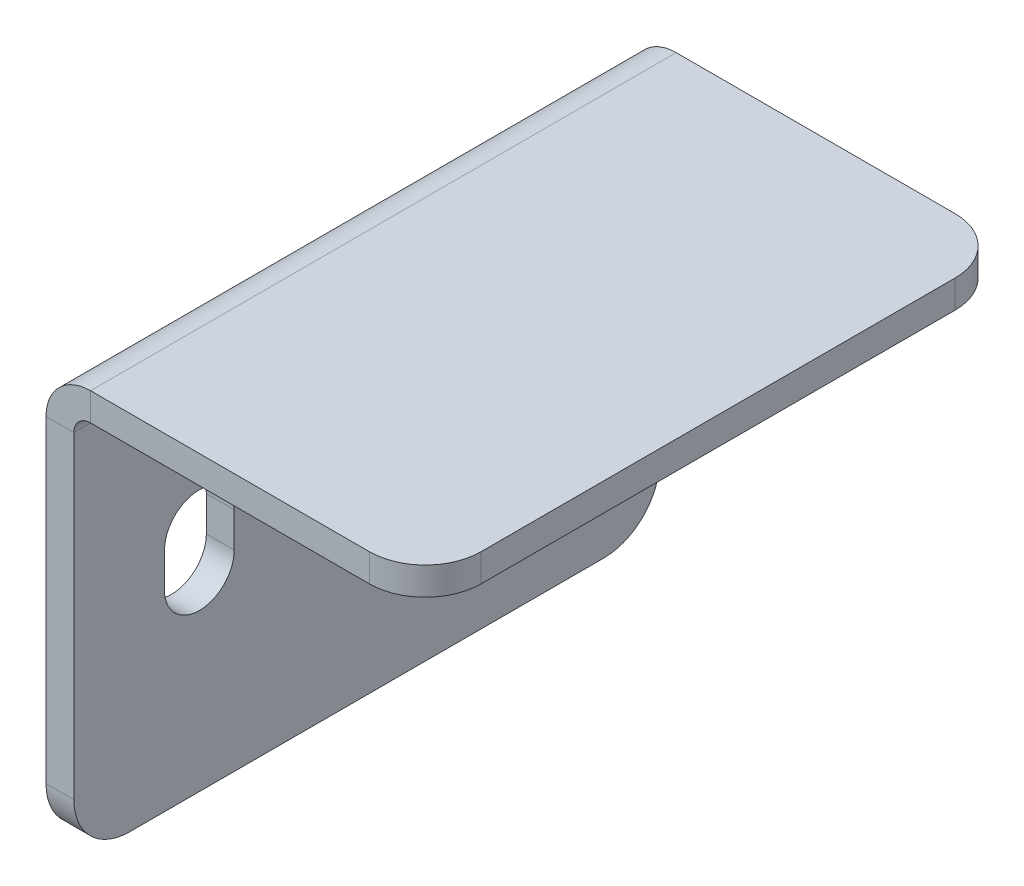
ISO-10303-21;
HEADER;
FILE_DESCRIPTION(('STEP AP214'),'2;1');
FILE_NAME('part.step','',(''),(''),'','','');
FILE_SCHEMA(('AUTOMOTIVE_DESIGN { 1 0 10303 214 1 1 1 1 }'));
ENDSEC;
DATA;
#1=APPLICATION_CONTEXT('core data for automotive mechanical design processes');
#2=APPLICATION_PROTOCOL_DEFINITION('international standard','automotive_design',2000,#1);
#3=PRODUCT_CONTEXT('',#1,'mechanical');
#4=PRODUCT('Part','Part','',(#3));
#5=PRODUCT_RELATED_PRODUCT_CATEGORY('part','',(#4));
#6=PRODUCT_DEFINITION_FORMATION('','',#4);
#7=PRODUCT_DEFINITION_CONTEXT('part definition',#1,'design');
#8=PRODUCT_DEFINITION('design','',#6,#7);
#9=PRODUCT_DEFINITION_SHAPE('','',#8);
#10=(LENGTH_UNIT() NAMED_UNIT(*) SI_UNIT(.MILLI.,.METRE.));
#11=(NAMED_UNIT(*) PLANE_ANGLE_UNIT() SI_UNIT($,.RADIAN.));
#12=(NAMED_UNIT(*) SI_UNIT($,.STERADIAN.) SOLID_ANGLE_UNIT());
#13=UNCERTAINTY_MEASURE_WITH_UNIT(LENGTH_MEASURE(1.E-05),#10,'distance_accuracy_value','');
#14=(GEOMETRIC_REPRESENTATION_CONTEXT(3) GLOBAL_UNCERTAINTY_ASSIGNED_CONTEXT((#13)) GLOBAL_UNIT_ASSIGNED_CONTEXT((#10,
#11,#12)) REPRESENTATION_CONTEXT('',''));
#15=CARTESIAN_POINT('',(0.,0.,0.));
#16=DIRECTION('',(0.,0.,1.));
#17=DIRECTION('',(1.,0.,0.));
#18=AXIS2_PLACEMENT_3D('',#15,#16,#17);
#19=CARTESIAN_POINT('',(12.,2.,-21.));
#20=DIRECTION('',(-1.,0.,0.));
#21=DIRECTION('',(0.,0.,1.));
#22=AXIS2_PLACEMENT_3D('',#19,#20,#21);
#23=PLANE('',#22);
#24=DIRECTION('',(0.,0.,-1.));
#25=VECTOR('',#24,1.);
#26=CARTESIAN_POINT('',(12.,0.,-21.));
#27=LINE('',#26,#25);
#28=CARTESIAN_POINT('',(12.,0.,17.));
#29=VERTEX_POINT('',#28);
#30=CARTESIAN_POINT('',(12.,0.,-17.));
#31=VERTEX_POINT('',#30);
#32=EDGE_CURVE('E354',#29,#31,#27,.T.);
#33=ORIENTED_EDGE('',*,*,#32,.T.);
#34=DIRECTION('',(0.,-1.,0.));
#35=VECTOR('',#34,1.);
#36=CARTESIAN_POINT('',(12.,2.,-17.));
#37=LINE('',#36,#35);
#38=CARTESIAN_POINT('',(12.,2.,-17.));
#39=VERTEX_POINT('',#38);
#40=EDGE_CURVE('E442',#31,#39,#37,.F.);
#41=ORIENTED_EDGE('',*,*,#40,.T.);
#42=DIRECTION('',(0.,0.,-1.));
#43=VECTOR('',#42,1.);
#44=CARTESIAN_POINT('',(12.,2.,-21.));
#45=LINE('',#44,#43);
#46=CARTESIAN_POINT('',(12.,2.,17.));
#47=VERTEX_POINT('',#46);
#48=EDGE_CURVE('E366',#47,#39,#45,.T.);
#49=ORIENTED_EDGE('',*,*,#48,.F.);
#50=DIRECTION('',(0.,-1.,0.));
#51=VECTOR('',#50,1.);
#52=CARTESIAN_POINT('',(12.,2.,17.));
#53=LINE('',#52,#51);
#54=EDGE_CURVE('E438',#47,#29,#53,.T.);
#55=ORIENTED_EDGE('',*,*,#54,.T.);
#56=EDGE_LOOP('',(#33,#41,#49,#55));
#57=FACE_BOUND('',#56,.T.);
#58=ADVANCED_FACE('F79',(#57),#23,.F.);
#59=CARTESIAN_POINT('',(-12.,2.,-21.));
#60=DIRECTION('',(0.,0.,1.));
#61=DIRECTION('',(1.,0.,0.));
#62=AXIS2_PLACEMENT_3D('',#59,#60,#61);
#63=PLANE('',#62);
#64=DIRECTION('',(-1.,0.,0.));
#65=VECTOR('',#64,1.);
#66=CARTESIAN_POINT('',(-12.,2.,-21.));
#67=LINE('',#66,#65);
#68=CARTESIAN_POINT('',(8.,2.,-21.));
#69=VERTEX_POINT('',#68);
#70=CARTESIAN_POINT('',(-12.,1.99999999999999,-21.));
#71=VERTEX_POINT('',#70);
#72=EDGE_CURVE('E370',#69,#71,#67,.T.);
#73=ORIENTED_EDGE('',*,*,#72,.F.);
#74=DIRECTION('',(0.,-1.,0.));
#75=VECTOR('',#74,1.);
#76=CARTESIAN_POINT('',(8.,2.,-21.));
#77=LINE('',#76,#75);
#78=CARTESIAN_POINT('',(8.,0.,-21.));
#79=VERTEX_POINT('',#78);
#80=EDGE_CURVE('E428',#69,#79,#77,.T.);
#81=ORIENTED_EDGE('',*,*,#80,.T.);
#82=DIRECTION('',(-1.,0.,0.));
#83=VECTOR('',#82,1.);
#84=CARTESIAN_POINT('',(-12.,0.,-21.));
#85=LINE('',#84,#83);
#86=CARTESIAN_POINT('',(-12.,0.,-21.));
#87=VERTEX_POINT('',#86);
#88=EDGE_CURVE('E386',#79,#87,#85,.T.);
#89=ORIENTED_EDGE('',*,*,#88,.T.);
#90=DIRECTION('',(0.,-1.,0.));
#91=VECTOR('',#90,1.);
#92=CARTESIAN_POINT('',(-12.,2.,-21.));
#93=LINE('',#92,#91);
#94=EDGE_CURVE('E398',#71,#87,#93,.T.);
#95=ORIENTED_EDGE('',*,*,#94,.F.);
#96=EDGE_LOOP('',(#73,#81,#89,#95));
#97=FACE_BOUND('',#96,.T.);
#98=ADVANCED_FACE('F460',(#97),#63,.F.);
#99=CARTESIAN_POINT('',(-12.,2.,21.));
#100=DIRECTION('',(0.,0.,-1.));
#101=DIRECTION('',(-1.,0.,0.));
#102=AXIS2_PLACEMENT_3D('',#99,#100,#101);
#103=PLANE('',#102);
#104=DIRECTION('',(1.,0.,0.));
#105=VECTOR('',#104,1.);
#106=CARTESIAN_POINT('',(-12.,0.,21.));
#107=LINE('',#106,#105);
#108=CARTESIAN_POINT('',(-12.,0.,21.));
#109=VERTEX_POINT('',#108);
#110=CARTESIAN_POINT('',(8.00000000000001,0.,21.));
#111=VERTEX_POINT('',#110);
#112=EDGE_CURVE('E371',#109,#111,#107,.T.);
#113=ORIENTED_EDGE('',*,*,#112,.T.);
#114=DIRECTION('',(0.,-1.,0.));
#115=VECTOR('',#114,1.);
#116=CARTESIAN_POINT('',(8.00000000000001,2.,21.));
#117=LINE('',#116,#115);
#118=CARTESIAN_POINT('',(8.00000000000001,2.,21.));
#119=VERTEX_POINT('',#118);
#120=EDGE_CURVE('E15',#111,#119,#117,.F.);
#121=ORIENTED_EDGE('',*,*,#120,.T.);
#122=DIRECTION('',(1.,0.,0.));
#123=VECTOR('',#122,1.);
#124=CARTESIAN_POINT('',(-12.,2.,21.));
#125=LINE('',#124,#123);
#126=CARTESIAN_POINT('',(-12.,2.,21.));
#127=VERTEX_POINT('',#126);
#128=EDGE_CURVE('E378',#127,#119,#125,.T.);
#129=ORIENTED_EDGE('',*,*,#128,.F.);
#130=DIRECTION('',(0.,-1.,0.));
#131=VECTOR('',#130,1.);
#132=CARTESIAN_POINT('',(-12.,2.,21.));
#133=LINE('',#132,#131);
#134=EDGE_CURVE('E382',#127,#109,#133,.T.);
#135=ORIENTED_EDGE('',*,*,#134,.T.);
#136=EDGE_LOOP('',(#113,#121,#129,#135));
#137=FACE_BOUND('',#136,.T.);
#138=ADVANCED_FACE('F474',(#137),#103,.F.);
#139=CARTESIAN_POINT('',(0.,2.,0.));
#140=DIRECTION('',(0.,1.,0.));
#141=DIRECTION('',(0.,0.,1.));
#142=AXIS2_PLACEMENT_3D('',#139,#140,#141);
#143=PLANE('',#142);
#144=ORIENTED_EDGE('',*,*,#48,.T.);
#145=CARTESIAN_POINT('',(8.,2.,-17.));
#146=DIRECTION('',(0.,1.,0.));
#147=DIRECTION('',(0.,0.,1.));
#148=AXIS2_PLACEMENT_3D('',#145,#146,#147);
#149=CIRCLE('',#148,4.);
#150=EDGE_CURVE('E88',#39,#69,#149,.T.);
#151=ORIENTED_EDGE('',*,*,#150,.T.);
#152=ORIENTED_EDGE('',*,*,#72,.T.);
#153=DIRECTION('',(0.,0.,1.));
#154=VECTOR('',#153,1.);
#155=CARTESIAN_POINT('',(-12.,2.,-21.));
#156=LINE('',#155,#154);
#157=EDGE_CURVE('E374',#71,#127,#156,.T.);
#158=ORIENTED_EDGE('',*,*,#157,.T.);
#159=ORIENTED_EDGE('',*,*,#128,.T.);
#160=CARTESIAN_POINT('',(8.00000000000001,2.,17.));
#161=DIRECTION('',(0.,1.,0.));
#162=DIRECTION('',(0.,0.,1.));
#163=AXIS2_PLACEMENT_3D('',#160,#161,#162);
#164=CIRCLE('',#163,4.);
#165=EDGE_CURVE('E445',#119,#47,#164,.T.);
#166=ORIENTED_EDGE('',*,*,#165,.T.);
#167=EDGE_LOOP('',(#144,#151,#152,#158,#159,#166));
#168=FACE_BOUND('',#167,.T.);
#169=ADVANCED_FACE('F452',(#168),#143,.T.);
#170=CARTESIAN_POINT('',(0.,0.,0.));
#171=DIRECTION('',(0.,1.,0.));
#172=DIRECTION('',(0.,0.,1.));
#173=AXIS2_PLACEMENT_3D('',#170,#171,#172);
#174=PLANE('',#173);
#175=ORIENTED_EDGE('',*,*,#88,.F.);
#176=CARTESIAN_POINT('',(8.,0.,-17.));
#177=DIRECTION('',(0.,1.,0.));
#178=DIRECTION('',(0.,0.,1.));
#179=AXIS2_PLACEMENT_3D('',#176,#177,#178);
#180=CIRCLE('',#179,4.);
#181=EDGE_CURVE('E435',#79,#31,#180,.F.);
#182=ORIENTED_EDGE('',*,*,#181,.T.);
#183=ORIENTED_EDGE('',*,*,#32,.F.);
#184=CARTESIAN_POINT('',(8.00000000000001,0.,17.));
#185=DIRECTION('',(0.,1.,0.));
#186=DIRECTION('',(0.,0.,1.));
#187=AXIS2_PLACEMENT_3D('',#184,#185,#186);
#188=CIRCLE('',#187,4.);
#189=EDGE_CURVE('E432',#29,#111,#188,.F.);
#190=ORIENTED_EDGE('',*,*,#189,.T.);
#191=ORIENTED_EDGE('',*,*,#112,.F.);
#192=DIRECTION('',(0.,0.,1.));
#193=VECTOR('',#192,1.);
#194=CARTESIAN_POINT('',(-12.,0.,-21.));
#195=LINE('',#194,#193);
#196=EDGE_CURVE('E389',#87,#109,#195,.T.);
#197=ORIENTED_EDGE('',*,*,#196,.F.);
#198=EDGE_LOOP('',(#175,#182,#183,#190,#191,#197));
#199=FACE_BOUND('',#198,.T.);
#200=ADVANCED_FACE('F465',(#199),#174,.F.);
#201=CARTESIAN_POINT('',(-12.,-1.2,21.));
#202=DIRECTION('',(0.,0.,1.));
#203=DIRECTION('',(0.,-1.,0.));
#204=AXIS2_PLACEMENT_3D('',#201,#202,#203);
#205=PLANE('',#204);
#206=DIRECTION('',(-1.,0.,0.));
#207=VECTOR('',#206,1.);
#208=CARTESIAN_POINT('',(-15.2,-1.19999999999999,21.));
#209=LINE('',#208,#207);
#210=CARTESIAN_POINT('',(-13.2,-1.2,21.));
#211=VERTEX_POINT('',#210);
#212=CARTESIAN_POINT('',(-15.2,-1.19999999999999,21.));
#213=VERTEX_POINT('',#212);
#214=EDGE_CURVE('E266',#211,#213,#209,.T.);
#215=ORIENTED_EDGE('',*,*,#214,.F.);
#216=CARTESIAN_POINT('',(-12.,-1.2,21.));
#217=DIRECTION('',(0.,0.,-1.));
#218=DIRECTION('',(0.,1.,0.));
#219=AXIS2_PLACEMENT_3D('',#216,#217,#218);
#220=CIRCLE('',#219,1.2);
#221=EDGE_CURVE('E359',#109,#211,#220,.F.);
#222=ORIENTED_EDGE('',*,*,#221,.F.);
#223=ORIENTED_EDGE('',*,*,#134,.F.);
#224=CARTESIAN_POINT('',(-12.,-1.2,21.));
#225=DIRECTION('',(0.,0.,-1.));
#226=DIRECTION('',(0.,1.,0.));
#227=AXIS2_PLACEMENT_3D('',#224,#225,#226);
#228=CIRCLE('',#227,3.2);
#229=EDGE_CURVE('E350',#127,#213,#228,.F.);
#230=ORIENTED_EDGE('',*,*,#229,.T.);
#231=EDGE_LOOP('',(#215,#222,#223,#230));
#232=FACE_BOUND('',#231,.T.);
#233=ADVANCED_FACE('F479',(#232),#205,.T.);
#234=CARTESIAN_POINT('',(-12.,-1.2,-21.));
#235=DIRECTION('',(0.,0.,1.));
#236=DIRECTION('',(0.,-1.,0.));
#237=AXIS2_PLACEMENT_3D('',#234,#235,#236);
#238=PLANE('',#237);
#239=CARTESIAN_POINT('',(-12.,-1.2,-21.));
#240=DIRECTION('',(0.,0.,-1.));
#241=DIRECTION('',(0.,1.,0.));
#242=AXIS2_PLACEMENT_3D('',#239,#240,#241);
#243=CIRCLE('',#242,1.2);
#244=CARTESIAN_POINT('',(-13.2,-1.2,-21.));
#245=VERTEX_POINT('',#244);
#246=EDGE_CURVE('E316',#245,#87,#243,.T.);
#247=ORIENTED_EDGE('',*,*,#246,.F.);
#248=DIRECTION('',(-1.,0.,0.));
#249=VECTOR('',#248,1.);
#250=CARTESIAN_POINT('',(-13.2,-1.2,-21.));
#251=LINE('',#250,#249);
#252=CARTESIAN_POINT('',(-15.2,-1.19999999999999,-21.));
#253=VERTEX_POINT('',#252);
#254=EDGE_CURVE('E340',#245,#253,#251,.T.);
#255=ORIENTED_EDGE('',*,*,#254,.T.);
#256=CARTESIAN_POINT('',(-12.,-1.2,-21.));
#257=DIRECTION('',(0.,0.,-1.));
#258=DIRECTION('',(0.,1.,0.));
#259=AXIS2_PLACEMENT_3D('',#256,#257,#258);
#260=CIRCLE('',#259,3.2);
#261=EDGE_CURVE('E355',#253,#71,#260,.T.);
#262=ORIENTED_EDGE('',*,*,#261,.T.);
#263=ORIENTED_EDGE('',*,*,#94,.T.);
#264=EDGE_LOOP('',(#247,#255,#262,#263));
#265=FACE_BOUND('',#264,.T.);
#266=ADVANCED_FACE('F485',(#265),#238,.F.);
#267=CARTESIAN_POINT('',(-12.,-1.2,-21.));
#268=DIRECTION('',(0.,0.,-1.));
#269=DIRECTION('',(-1.,0.,0.));
#270=AXIS2_PLACEMENT_3D('',#267,#268,#269);
#271=CYLINDRICAL_SURFACE('',#270,3.2);
#272=ORIENTED_EDGE('',*,*,#157,.F.);
#273=ORIENTED_EDGE('',*,*,#261,.F.);
#274=DIRECTION('',(0.,0.,-1.));
#275=VECTOR('',#274,1.);
#276=CARTESIAN_POINT('',(-15.2,-1.19999999999999,0.));
#277=LINE('',#276,#275);
#278=EDGE_CURVE('E336',#213,#253,#277,.T.);
#279=ORIENTED_EDGE('',*,*,#278,.F.);
#280=ORIENTED_EDGE('',*,*,#229,.F.);
#281=EDGE_LOOP('',(#272,#273,#279,#280));
#282=FACE_BOUND('',#281,.T.);
#283=ADVANCED_FACE('F482',(#282),#271,.T.);
#284=CARTESIAN_POINT('',(-12.,-1.2,-21.));
#285=DIRECTION('',(0.,0.,-1.));
#286=DIRECTION('',(-1.,0.,0.));
#287=AXIS2_PLACEMENT_3D('',#284,#285,#286);
#288=CYLINDRICAL_SURFACE('',#287,1.2);
#289=ORIENTED_EDGE('',*,*,#196,.T.);
#290=ORIENTED_EDGE('',*,*,#221,.T.);
#291=DIRECTION('',(0.,0.,1.));
#292=VECTOR('',#291,1.);
#293=CARTESIAN_POINT('',(-13.2,-1.2,21.));
#294=LINE('',#293,#292);
#295=EDGE_CURVE('E344',#211,#245,#294,.F.);
#296=ORIENTED_EDGE('',*,*,#295,.T.);
#297=ORIENTED_EDGE('',*,*,#246,.T.);
#298=EDGE_LOOP('',(#289,#290,#296,#297));
#299=FACE_BOUND('',#298,.T.);
#300=ADVANCED_FACE('F514',(#299),#288,.F.);
#301=CARTESIAN_POINT('',(-15.2,0.,-21.));
#302=DIRECTION('',(0.,0.,-1.));
#303=DIRECTION('',(0.,1.,0.));
#304=AXIS2_PLACEMENT_3D('',#301,#302,#303);
#305=PLANE('',#304);
#306=DIRECTION('',(0.,-1.,0.));
#307=VECTOR('',#306,1.);
#308=CARTESIAN_POINT('',(-13.2,0.,-21.));
#309=LINE('',#308,#307);
#310=CARTESIAN_POINT('',(-13.2000000000001,-24.,-21.));
#311=VERTEX_POINT('',#310);
#312=EDGE_CURVE('E325',#311,#245,#309,.F.);
#313=ORIENTED_EDGE('',*,*,#312,.F.);
#314=DIRECTION('',(1.,0.,0.));
#315=VECTOR('',#314,1.);
#316=CARTESIAN_POINT('',(-15.2000000000001,-24.,-21.));
#317=LINE('',#316,#315);
#318=CARTESIAN_POINT('',(-15.2000000000001,-24.,-21.));
#319=VERTEX_POINT('',#318);
#320=EDGE_CURVE('E415',#311,#319,#317,.F.);
#321=ORIENTED_EDGE('',*,*,#320,.T.);
#322=DIRECTION('',(0.,1.,0.));
#323=VECTOR('',#322,1.);
#324=CARTESIAN_POINT('',(-15.2,0.,-21.));
#325=LINE('',#324,#323);
#326=EDGE_CURVE('E313',#319,#253,#325,.T.);
#327=ORIENTED_EDGE('',*,*,#326,.T.);
#328=ORIENTED_EDGE('',*,*,#254,.F.);
#329=EDGE_LOOP('',(#313,#321,#327,#328));
#330=FACE_BOUND('',#329,.T.);
#331=ADVANCED_FACE('F512',(#330),#305,.T.);
#332=CARTESIAN_POINT('',(-15.2000000000001,-28.,21.));
#333=DIRECTION('',(0.,0.,1.));
#334=DIRECTION('',(0.,-1.,0.));
#335=AXIS2_PLACEMENT_3D('',#332,#333,#334);
#336=PLANE('',#335);
#337=DIRECTION('',(0.,-1.,0.));
#338=VECTOR('',#337,1.);
#339=CARTESIAN_POINT('',(-15.2000000000001,-28.,21.));
#340=LINE('',#339,#338);
#341=CARTESIAN_POINT('',(-15.2000000000001,-24.,21.));
#342=VERTEX_POINT('',#341);
#343=EDGE_CURVE('E321',#213,#342,#340,.T.);
#344=ORIENTED_EDGE('',*,*,#343,.T.);
#345=DIRECTION('',(1.,0.,0.));
#346=VECTOR('',#345,1.);
#347=CARTESIAN_POINT('',(-15.2000000000001,-24.,21.));
#348=LINE('',#347,#346);
#349=CARTESIAN_POINT('',(-13.2000000000001,-24.,21.));
#350=VERTEX_POINT('',#349);
#351=EDGE_CURVE('E424',#342,#350,#348,.T.);
#352=ORIENTED_EDGE('',*,*,#351,.T.);
#353=DIRECTION('',(0.,1.,0.));
#354=VECTOR('',#353,1.);
#355=CARTESIAN_POINT('',(-13.2,0.,21.));
#356=LINE('',#355,#354);
#357=EDGE_CURVE('E332',#211,#350,#356,.F.);
#358=ORIENTED_EDGE('',*,*,#357,.F.);
#359=ORIENTED_EDGE('',*,*,#214,.T.);
#360=EDGE_LOOP('',(#344,#352,#358,#359));
#361=FACE_BOUND('',#360,.T.);
#362=ADVANCED_FACE('F497',(#361),#336,.T.);
#363=CARTESIAN_POINT('',(-15.2,0.,0.));
#364=DIRECTION('',(-1.,0.,0.));
#365=DIRECTION('',(0.,-1.,0.));
#366=AXIS2_PLACEMENT_3D('',#363,#364,#365);
#367=PLANE('',#366);
#368=CARTESIAN_POINT('',(-15.2,-14.25,-12.));
#369=DIRECTION('',(1.,0.,0.));
#370=DIRECTION('',(0.,-1.,0.));
#371=AXIS2_PLACEMENT_3D('',#368,#369,#370);
#372=CIRCLE('',#371,2.5);
#373=CARTESIAN_POINT('',(-15.2,-14.25,-9.49999999999999));
#374=VERTEX_POINT('',#373);
#375=CARTESIAN_POINT('',(-15.2,-14.25,-14.5));
#376=VERTEX_POINT('',#375);
#377=EDGE_CURVE('E220',#374,#376,#372,.T.);
#378=ORIENTED_EDGE('',*,*,#377,.T.);
#379=DIRECTION('',(0.,1.,0.));
#380=VECTOR('',#379,1.);
#381=CARTESIAN_POINT('',(-15.2,-14.25,-14.5));
#382=LINE('',#381,#380);
#383=CARTESIAN_POINT('',(-15.2,-11.75,-14.5));
#384=VERTEX_POINT('',#383);
#385=EDGE_CURVE('E232',#376,#384,#382,.T.);
#386=ORIENTED_EDGE('',*,*,#385,.T.);
#387=CARTESIAN_POINT('',(-15.2,-11.75,-12.));
#388=DIRECTION('',(1.,0.,0.));
#389=DIRECTION('',(0.,-1.,0.));
#390=AXIS2_PLACEMENT_3D('',#387,#388,#389);
#391=CIRCLE('',#390,2.5);
#392=CARTESIAN_POINT('',(-15.2,-11.75,-9.49999999999999));
#393=VERTEX_POINT('',#392);
#394=EDGE_CURVE('E95',#384,#393,#391,.T.);
#395=ORIENTED_EDGE('',*,*,#394,.T.);
#396=DIRECTION('',(0.,-1.,0.));
#397=VECTOR('',#396,1.);
#398=CARTESIAN_POINT('',(-15.2,-14.25,-9.49999999999999));
#399=LINE('',#398,#397);
#400=EDGE_CURVE('E229',#393,#374,#399,.T.);
#401=ORIENTED_EDGE('',*,*,#400,.T.);
#402=EDGE_LOOP('',(#378,#386,#395,#401));
#403=FACE_BOUND('',#402,.T.);
#404=CARTESIAN_POINT('',(-15.2,-14.25,12.));
#405=DIRECTION('',(1.,0.,0.));
#406=DIRECTION('',(0.,1.,0.));
#407=AXIS2_PLACEMENT_3D('',#404,#405,#406);
#408=CIRCLE('',#407,2.5);
#409=CARTESIAN_POINT('',(-15.2,-14.25,14.5));
#410=VERTEX_POINT('',#409);
#411=CARTESIAN_POINT('',(-15.2,-14.25,9.49999999999999));
#412=VERTEX_POINT('',#411);
#413=EDGE_CURVE('E272',#410,#412,#408,.T.);
#414=ORIENTED_EDGE('',*,*,#413,.T.);
#415=DIRECTION('',(0.,1.,0.));
#416=VECTOR('',#415,1.);
#417=CARTESIAN_POINT('',(-15.2,-14.25,9.49999999999999));
#418=LINE('',#417,#416);
#419=CARTESIAN_POINT('',(-15.2,-11.75,9.49999999999999));
#420=VERTEX_POINT('',#419);
#421=EDGE_CURVE('E276',#412,#420,#418,.T.);
#422=ORIENTED_EDGE('',*,*,#421,.T.);
#423=CARTESIAN_POINT('',(-15.2,-11.75,12.));
#424=DIRECTION('',(1.,0.,0.));
#425=DIRECTION('',(0.,1.,0.));
#426=AXIS2_PLACEMENT_3D('',#423,#424,#425);
#427=CIRCLE('',#426,2.5);
#428=CARTESIAN_POINT('',(-15.2,-11.75,14.5));
#429=VERTEX_POINT('',#428);
#430=EDGE_CURVE('E103',#420,#429,#427,.T.);
#431=ORIENTED_EDGE('',*,*,#430,.T.);
#432=DIRECTION('',(0.,-1.,0.));
#433=VECTOR('',#432,1.);
#434=CARTESIAN_POINT('',(-15.2,-14.25,14.5));
#435=LINE('',#434,#433);
#436=EDGE_CURVE('E283',#429,#410,#435,.T.);
#437=ORIENTED_EDGE('',*,*,#436,.T.);
#438=EDGE_LOOP('',(#414,#422,#431,#437));
#439=FACE_BOUND('',#438,.T.);
#440=ORIENTED_EDGE('',*,*,#326,.F.);
#441=CARTESIAN_POINT('',(-15.2000000000001,-24.,-17.));
#442=DIRECTION('',(-1.,0.,0.));
#443=DIRECTION('',(0.,-1.,0.));
#444=AXIS2_PLACEMENT_3D('',#441,#442,#443);
#445=CIRCLE('',#444,4.);
#446=CARTESIAN_POINT('',(-15.2000000000001,-28.,-17.));
#447=VERTEX_POINT('',#446);
#448=EDGE_CURVE('E421',#319,#447,#445,.T.);
#449=ORIENTED_EDGE('',*,*,#448,.T.);
#450=DIRECTION('',(0.,0.,-1.));
#451=VECTOR('',#450,1.);
#452=CARTESIAN_POINT('',(-15.2000000000001,-28.,-21.));
#453=LINE('',#452,#451);
#454=CARTESIAN_POINT('',(-15.2000000000001,-28.,17.));
#455=VERTEX_POINT('',#454);
#456=EDGE_CURVE('E317',#455,#447,#453,.T.);
#457=ORIENTED_EDGE('',*,*,#456,.F.);
#458=CARTESIAN_POINT('',(-15.2000000000001,-24.,17.));
#459=DIRECTION('',(-1.,0.,0.));
#460=DIRECTION('',(0.,-1.,0.));
#461=AXIS2_PLACEMENT_3D('',#458,#459,#460);
#462=CIRCLE('',#461,4.);
#463=EDGE_CURVE('E418',#455,#342,#462,.T.);
#464=ORIENTED_EDGE('',*,*,#463,.T.);
#465=ORIENTED_EDGE('',*,*,#343,.F.);
#466=ORIENTED_EDGE('',*,*,#278,.T.);
#467=EDGE_LOOP('',(#440,#449,#457,#464,#465,#466));
#468=FACE_BOUND('',#467,.T.);
#469=ADVANCED_FACE('F237',(#403,#439,#468),#367,.T.);
#470=CARTESIAN_POINT('',(-13.2,0.,0.));
#471=DIRECTION('',(-1.,0.,0.));
#472=DIRECTION('',(0.,-1.,0.));
#473=AXIS2_PLACEMENT_3D('',#470,#471,#472);
#474=PLANE('',#473);
#475=DIRECTION('',(0.,1.,0.));
#476=VECTOR('',#475,1.);
#477=CARTESIAN_POINT('',(-13.2,-14.25,-14.5));
#478=LINE('',#477,#476);
#479=CARTESIAN_POINT('',(-13.2,-14.25,-14.5));
#480=VERTEX_POINT('',#479);
#481=CARTESIAN_POINT('',(-13.2,-11.75,-14.5));
#482=VERTEX_POINT('',#481);
#483=EDGE_CURVE('E256',#480,#482,#478,.T.);
#484=ORIENTED_EDGE('',*,*,#483,.F.);
#485=CARTESIAN_POINT('',(-13.2,-14.25,-12.));
#486=DIRECTION('',(1.,0.,0.));
#487=DIRECTION('',(0.,-1.,0.));
#488=AXIS2_PLACEMENT_3D('',#485,#486,#487);
#489=CIRCLE('',#488,2.5);
#490=CARTESIAN_POINT('',(-13.2,-14.25,-9.49999999999999));
#491=VERTEX_POINT('',#490);
#492=EDGE_CURVE('E223',#491,#480,#489,.T.);
#493=ORIENTED_EDGE('',*,*,#492,.F.);
#494=DIRECTION('',(0.,-1.,0.));
#495=VECTOR('',#494,1.);
#496=CARTESIAN_POINT('',(-13.2,-14.25,-9.49999999999999));
#497=LINE('',#496,#495);
#498=CARTESIAN_POINT('',(-13.2,-11.75,-9.49999999999999));
#499=VERTEX_POINT('',#498);
#500=EDGE_CURVE('E241',#499,#491,#497,.T.);
#501=ORIENTED_EDGE('',*,*,#500,.F.);
#502=CARTESIAN_POINT('',(-13.2,-11.75,-12.));
#503=DIRECTION('',(1.,0.,0.));
#504=DIRECTION('',(0.,-1.,0.));
#505=AXIS2_PLACEMENT_3D('',#502,#503,#504);
#506=CIRCLE('',#505,2.5);
#507=EDGE_CURVE('E247',#482,#499,#506,.T.);
#508=ORIENTED_EDGE('',*,*,#507,.F.);
#509=EDGE_LOOP('',(#484,#493,#501,#508));
#510=FACE_BOUND('',#509,.T.);
#511=DIRECTION('',(0.,1.,0.));
#512=VECTOR('',#511,1.);
#513=CARTESIAN_POINT('',(-13.2,-14.25,9.49999999999999));
#514=LINE('',#513,#512);
#515=CARTESIAN_POINT('',(-13.2,-14.25,9.49999999999999));
#516=VERTEX_POINT('',#515);
#517=CARTESIAN_POINT('',(-13.2,-11.75,9.49999999999999));
#518=VERTEX_POINT('',#517);
#519=EDGE_CURVE('E291',#516,#518,#514,.T.);
#520=ORIENTED_EDGE('',*,*,#519,.F.);
#521=CARTESIAN_POINT('',(-13.2,-14.25,12.));
#522=DIRECTION('',(1.,0.,0.));
#523=DIRECTION('',(0.,1.,0.));
#524=AXIS2_PLACEMENT_3D('',#521,#522,#523);
#525=CIRCLE('',#524,2.5);
#526=CARTESIAN_POINT('',(-13.2,-14.25,14.5));
#527=VERTEX_POINT('',#526);
#528=EDGE_CURVE('E288',#527,#516,#525,.T.);
#529=ORIENTED_EDGE('',*,*,#528,.F.);
#530=DIRECTION('',(0.,-1.,0.));
#531=VECTOR('',#530,1.);
#532=CARTESIAN_POINT('',(-13.2,-14.25,14.5));
#533=LINE('',#532,#531);
#534=CARTESIAN_POINT('',(-13.2,-11.75,14.5));
#535=VERTEX_POINT('',#534);
#536=EDGE_CURVE('E277',#535,#527,#533,.T.);
#537=ORIENTED_EDGE('',*,*,#536,.F.);
#538=CARTESIAN_POINT('',(-13.2,-11.75,12.));
#539=DIRECTION('',(1.,0.,0.));
#540=DIRECTION('',(0.,1.,0.));
#541=AXIS2_PLACEMENT_3D('',#538,#539,#540);
#542=CIRCLE('',#541,2.5);
#543=EDGE_CURVE('E295',#518,#535,#542,.T.);
#544=ORIENTED_EDGE('',*,*,#543,.F.);
#545=EDGE_LOOP('',(#520,#529,#537,#544));
#546=FACE_BOUND('',#545,.T.);
#547=DIRECTION('',(0.,0.,1.));
#548=VECTOR('',#547,1.);
#549=CARTESIAN_POINT('',(-13.2000000000001,-28.,0.));
#550=LINE('',#549,#548);
#551=CARTESIAN_POINT('',(-13.2000000000001,-28.,17.));
#552=VERTEX_POINT('',#551);
#553=CARTESIAN_POINT('',(-13.2000000000001,-28.,-17.));
#554=VERTEX_POINT('',#553);
#555=EDGE_CURVE('E328',#552,#554,#550,.F.);
#556=ORIENTED_EDGE('',*,*,#555,.T.);
#557=CARTESIAN_POINT('',(-13.2000000000001,-24.,-17.));
#558=DIRECTION('',(-1.,0.,0.));
#559=DIRECTION('',(0.,-1.,0.));
#560=AXIS2_PLACEMENT_3D('',#557,#558,#559);
#561=CIRCLE('',#560,4.);
#562=EDGE_CURVE('E412',#554,#311,#561,.F.);
#563=ORIENTED_EDGE('',*,*,#562,.T.);
#564=ORIENTED_EDGE('',*,*,#312,.T.);
#565=ORIENTED_EDGE('',*,*,#295,.F.);
#566=ORIENTED_EDGE('',*,*,#357,.T.);
#567=CARTESIAN_POINT('',(-13.2000000000001,-24.,17.));
#568=DIRECTION('',(-1.,0.,0.));
#569=DIRECTION('',(0.,-1.,0.));
#570=AXIS2_PLACEMENT_3D('',#567,#568,#569);
#571=CIRCLE('',#570,4.);
#572=EDGE_CURVE('E409',#350,#552,#571,.F.);
#573=ORIENTED_EDGE('',*,*,#572,.T.);
#574=EDGE_LOOP('',(#556,#563,#564,#565,#566,#573));
#575=FACE_BOUND('',#574,.T.);
#576=ADVANCED_FACE('F504',(#510,#546,#575),#474,.F.);
#577=CARTESIAN_POINT('',(-15.2000000000001,-28.,-21.));
#578=DIRECTION('',(0.,-1.,0.));
#579=DIRECTION('',(1.,0.,0.));
#580=AXIS2_PLACEMENT_3D('',#577,#578,#579);
#581=PLANE('',#580);
#582=ORIENTED_EDGE('',*,*,#456,.T.);
#583=DIRECTION('',(1.,0.,0.));
#584=VECTOR('',#583,1.);
#585=CARTESIAN_POINT('',(-15.2000000000001,-28.,-17.));
#586=LINE('',#585,#584);
#587=EDGE_CURVE('E405',#447,#554,#586,.T.);
#588=ORIENTED_EDGE('',*,*,#587,.T.);
#589=ORIENTED_EDGE('',*,*,#555,.F.);
#590=DIRECTION('',(1.,0.,0.));
#591=VECTOR('',#590,1.);
#592=CARTESIAN_POINT('',(-15.2000000000001,-28.,17.));
#593=LINE('',#592,#591);
#594=EDGE_CURVE('E402',#552,#455,#593,.F.);
#595=ORIENTED_EDGE('',*,*,#594,.T.);
#596=EDGE_LOOP('',(#582,#588,#589,#595));
#597=FACE_BOUND('',#596,.T.);
#598=ADVANCED_FACE('F507',(#597),#581,.T.);
#599=CARTESIAN_POINT('',(-15.2000000000001,-24.,-17.));
#600=DIRECTION('',(1.,0.,0.));
#601=DIRECTION('',(0.,1.,0.));
#602=AXIS2_PLACEMENT_3D('',#599,#600,#601);
#603=CYLINDRICAL_SURFACE('',#602,4.);
#604=ORIENTED_EDGE('',*,*,#448,.F.);
#605=ORIENTED_EDGE('',*,*,#320,.F.);
#606=ORIENTED_EDGE('',*,*,#562,.F.);
#607=ORIENTED_EDGE('',*,*,#587,.F.);
#608=EDGE_LOOP('',(#604,#605,#606,#607));
#609=FACE_BOUND('',#608,.T.);
#610=ADVANCED_FACE('F510',(#609),#603,.T.);
#611=CARTESIAN_POINT('',(-15.2000000000001,-24.,17.));
#612=DIRECTION('',(1.,0.,0.));
#613=DIRECTION('',(0.,1.,0.));
#614=AXIS2_PLACEMENT_3D('',#611,#612,#613);
#615=CYLINDRICAL_SURFACE('',#614,4.);
#616=ORIENTED_EDGE('',*,*,#463,.F.);
#617=ORIENTED_EDGE('',*,*,#594,.F.);
#618=ORIENTED_EDGE('',*,*,#572,.F.);
#619=ORIENTED_EDGE('',*,*,#351,.F.);
#620=EDGE_LOOP('',(#616,#617,#618,#619));
#621=FACE_BOUND('',#620,.T.);
#622=ADVANCED_FACE('F500',(#621),#615,.T.);
#623=CARTESIAN_POINT('',(8.,2.,-17.));
#624=DIRECTION('',(0.,-1.,0.));
#625=DIRECTION('',(0.,0.,-1.));
#626=AXIS2_PLACEMENT_3D('',#623,#624,#625);
#627=CYLINDRICAL_SURFACE('',#626,4.);
#628=ORIENTED_EDGE('',*,*,#150,.F.);
#629=ORIENTED_EDGE('',*,*,#40,.F.);
#630=ORIENTED_EDGE('',*,*,#181,.F.);
#631=ORIENTED_EDGE('',*,*,#80,.F.);
#632=EDGE_LOOP('',(#628,#629,#630,#631));
#633=FACE_BOUND('',#632,.T.);
#634=ADVANCED_FACE('F462',(#633),#627,.T.);
#635=CARTESIAN_POINT('',(8.00000000000001,2.,17.));
#636=DIRECTION('',(0.,-1.,0.));
#637=DIRECTION('',(0.,0.,-1.));
#638=AXIS2_PLACEMENT_3D('',#635,#636,#637);
#639=CYLINDRICAL_SURFACE('',#638,4.);
#640=ORIENTED_EDGE('',*,*,#165,.F.);
#641=ORIENTED_EDGE('',*,*,#120,.F.);
#642=ORIENTED_EDGE('',*,*,#189,.F.);
#643=ORIENTED_EDGE('',*,*,#54,.F.);
#644=EDGE_LOOP('',(#640,#641,#642,#643));
#645=FACE_BOUND('',#644,.T.);
#646=ADVANCED_FACE('F81',(#645),#639,.T.);
#647=CARTESIAN_POINT('',(-15.2,-14.25,12.));
#648=DIRECTION('',(1.,0.,0.));
#649=DIRECTION('',(0.,1.,0.));
#650=AXIS2_PLACEMENT_3D('',#647,#648,#649);
#651=CYLINDRICAL_SURFACE('',#650,2.5);
#652=ORIENTED_EDGE('',*,*,#528,.T.);
#653=DIRECTION('',(1.,0.,0.));
#654=VECTOR('',#653,1.);
#655=CARTESIAN_POINT('',(-15.2,-14.25,9.49999999999999));
#656=LINE('',#655,#654);
#657=EDGE_CURVE('E287',#412,#516,#656,.T.);
#658=ORIENTED_EDGE('',*,*,#657,.F.);
#659=ORIENTED_EDGE('',*,*,#413,.F.);
#660=DIRECTION('',(1.,0.,0.));
#661=VECTOR('',#660,1.);
#662=CARTESIAN_POINT('',(-15.2,-14.25,14.5));
#663=LINE('',#662,#661);
#664=EDGE_CURVE('E257',#410,#527,#663,.T.);
#665=ORIENTED_EDGE('',*,*,#664,.T.);
#666=EDGE_LOOP('',(#652,#658,#659,#665));
#667=FACE_BOUND('',#666,.T.);
#668=ADVANCED_FACE('F540',(#667),#651,.F.);
#669=CARTESIAN_POINT('',(-15.2,-14.25,14.5));
#670=DIRECTION('',(0.,0.,1.));
#671=DIRECTION('',(1.,0.,0.));
#672=AXIS2_PLACEMENT_3D('',#669,#670,#671);
#673=PLANE('',#672);
#674=ORIENTED_EDGE('',*,*,#536,.T.);
#675=ORIENTED_EDGE('',*,*,#664,.F.);
#676=ORIENTED_EDGE('',*,*,#436,.F.);
#677=DIRECTION('',(1.,0.,0.));
#678=VECTOR('',#677,1.);
#679=CARTESIAN_POINT('',(-15.2,-11.75,14.5));
#680=LINE('',#679,#678);
#681=EDGE_CURVE('E304',#429,#535,#680,.T.);
#682=ORIENTED_EDGE('',*,*,#681,.T.);
#683=EDGE_LOOP('',(#674,#675,#676,#682));
#684=FACE_BOUND('',#683,.T.);
#685=ADVANCED_FACE('F544',(#684),#673,.F.);
#686=CARTESIAN_POINT('',(-15.2,-11.75,12.));
#687=DIRECTION('',(1.,0.,0.));
#688=DIRECTION('',(0.,1.,0.));
#689=AXIS2_PLACEMENT_3D('',#686,#687,#688);
#690=CYLINDRICAL_SURFACE('',#689,2.5);
#691=ORIENTED_EDGE('',*,*,#543,.T.);
#692=ORIENTED_EDGE('',*,*,#681,.F.);
#693=ORIENTED_EDGE('',*,*,#430,.F.);
#694=DIRECTION('',(1.,0.,0.));
#695=VECTOR('',#694,1.);
#696=CARTESIAN_POINT('',(-15.2,-11.75,9.49999999999999));
#697=LINE('',#696,#695);
#698=EDGE_CURVE('E307',#420,#518,#697,.T.);
#699=ORIENTED_EDGE('',*,*,#698,.T.);
#700=EDGE_LOOP('',(#691,#692,#693,#699));
#701=FACE_BOUND('',#700,.T.);
#702=ADVANCED_FACE('F550',(#701),#690,.F.);
#703=CARTESIAN_POINT('',(-15.2,-14.25,9.49999999999999));
#704=DIRECTION('',(0.,0.,-1.));
#705=DIRECTION('',(-1.,0.,0.));
#706=AXIS2_PLACEMENT_3D('',#703,#704,#705);
#707=PLANE('',#706);
#708=ORIENTED_EDGE('',*,*,#519,.T.);
#709=ORIENTED_EDGE('',*,*,#698,.F.);
#710=ORIENTED_EDGE('',*,*,#421,.F.);
#711=ORIENTED_EDGE('',*,*,#657,.T.);
#712=EDGE_LOOP('',(#708,#709,#710,#711));
#713=FACE_BOUND('',#712,.T.);
#714=ADVANCED_FACE('F555',(#713),#707,.F.);
#715=CARTESIAN_POINT('',(-15.2,-14.25,-12.));
#716=DIRECTION('',(1.,0.,0.));
#717=DIRECTION('',(0.,1.,0.));
#718=AXIS2_PLACEMENT_3D('',#715,#716,#717);
#719=CYLINDRICAL_SURFACE('',#718,2.5);
#720=ORIENTED_EDGE('',*,*,#492,.T.);
#721=DIRECTION('',(1.,0.,0.));
#722=VECTOR('',#721,1.);
#723=CARTESIAN_POINT('',(-15.2,-14.25,-14.5));
#724=LINE('',#723,#722);
#725=EDGE_CURVE('E216',#376,#480,#724,.T.);
#726=ORIENTED_EDGE('',*,*,#725,.F.);
#727=ORIENTED_EDGE('',*,*,#377,.F.);
#728=DIRECTION('',(1.,0.,0.));
#729=VECTOR('',#728,1.);
#730=CARTESIAN_POINT('',(-15.2,-14.25,-9.49999999999999));
#731=LINE('',#730,#729);
#732=EDGE_CURVE('E263',#374,#491,#731,.T.);
#733=ORIENTED_EDGE('',*,*,#732,.T.);
#734=EDGE_LOOP('',(#720,#726,#727,#733));
#735=FACE_BOUND('',#734,.T.);
#736=ADVANCED_FACE('F218',(#735),#719,.F.);
#737=CARTESIAN_POINT('',(-15.2,-14.25,-9.49999999999999));
#738=DIRECTION('',(0.,0.,1.));
#739=DIRECTION('',(1.,0.,0.));
#740=AXIS2_PLACEMENT_3D('',#737,#738,#739);
#741=PLANE('',#740);
#742=ORIENTED_EDGE('',*,*,#500,.T.);
#743=ORIENTED_EDGE('',*,*,#732,.F.);
#744=ORIENTED_EDGE('',*,*,#400,.F.);
#745=DIRECTION('',(1.,0.,0.));
#746=VECTOR('',#745,1.);
#747=CARTESIAN_POINT('',(-15.2,-11.75,-9.49999999999999));
#748=LINE('',#747,#746);
#749=EDGE_CURVE('E267',#393,#499,#748,.T.);
#750=ORIENTED_EDGE('',*,*,#749,.T.);
#751=EDGE_LOOP('',(#742,#743,#744,#750));
#752=FACE_BOUND('',#751,.T.);
#753=ADVANCED_FACE('F580',(#752),#741,.F.);
#754=CARTESIAN_POINT('',(-15.2,-11.75,-12.));
#755=DIRECTION('',(1.,0.,0.));
#756=DIRECTION('',(0.,1.,0.));
#757=AXIS2_PLACEMENT_3D('',#754,#755,#756);
#758=CYLINDRICAL_SURFACE('',#757,2.5);
#759=ORIENTED_EDGE('',*,*,#507,.T.);
#760=ORIENTED_EDGE('',*,*,#749,.F.);
#761=ORIENTED_EDGE('',*,*,#394,.F.);
#762=DIRECTION('',(1.,0.,0.));
#763=VECTOR('',#762,1.);
#764=CARTESIAN_POINT('',(-15.2,-11.75,-14.5));
#765=LINE('',#764,#763);
#766=EDGE_CURVE('E228',#384,#482,#765,.T.);
#767=ORIENTED_EDGE('',*,*,#766,.T.);
#768=EDGE_LOOP('',(#759,#760,#761,#767));
#769=FACE_BOUND('',#768,.T.);
#770=ADVANCED_FACE('F583',(#769),#758,.F.);
#771=CARTESIAN_POINT('',(-15.2,-14.25,-14.5));
#772=DIRECTION('',(0.,0.,-1.));
#773=DIRECTION('',(-1.,0.,0.));
#774=AXIS2_PLACEMENT_3D('',#771,#772,#773);
#775=PLANE('',#774);
#776=ORIENTED_EDGE('',*,*,#483,.T.);
#777=ORIENTED_EDGE('',*,*,#766,.F.);
#778=ORIENTED_EDGE('',*,*,#385,.F.);
#779=ORIENTED_EDGE('',*,*,#725,.T.);
#780=EDGE_LOOP('',(#776,#777,#778,#779));
#781=FACE_BOUND('',#780,.T.);
#782=ADVANCED_FACE('F233',(#781),#775,.F.);
#783=CLOSED_SHELL('',(#58,#98,#138,#169,#200,#233,#266,#283,#300,#331,#362,#469,#576,#598,#610,
#622,#634,#646,#668,#685,#702,#714,#736,#753,#770,#782));
#784=MANIFOLD_SOLID_BREP('B2',#783);
#785=ADVANCED_BREP_SHAPE_REPRESENTATION('',(#18,#784),#14);
#786=SHAPE_DEFINITION_REPRESENTATION(#9,#785);
ENDSEC;
END-ISO-10303-21;
